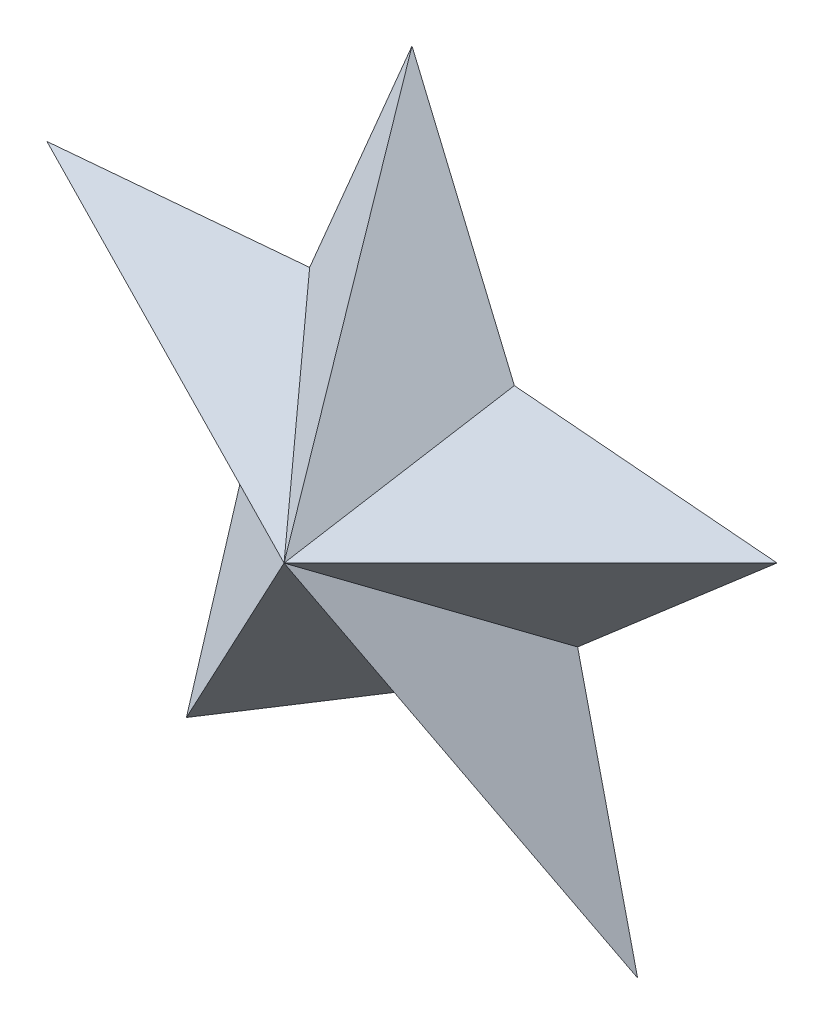
ISO-10303-21;
HEADER;
FILE_DESCRIPTION(('STEP AP214'),'2;1');
FILE_NAME('part.step','',(''),(''),'','','');
FILE_SCHEMA(('AUTOMOTIVE_DESIGN { 1 0 10303 214 1 1 1 1 }'));
ENDSEC;
DATA;
#1=APPLICATION_CONTEXT('core data for automotive mechanical design processes');
#2=APPLICATION_PROTOCOL_DEFINITION('international standard','automotive_design',2000,#1);
#3=PRODUCT_CONTEXT('',#1,'mechanical');
#4=PRODUCT('Part','Part','',(#3));
#5=PRODUCT_RELATED_PRODUCT_CATEGORY('part','',(#4));
#6=PRODUCT_DEFINITION_FORMATION('','',#4);
#7=PRODUCT_DEFINITION_CONTEXT('part definition',#1,'design');
#8=PRODUCT_DEFINITION('design','',#6,#7);
#9=PRODUCT_DEFINITION_SHAPE('','',#8);
#10=(LENGTH_UNIT() NAMED_UNIT(*) SI_UNIT(.MILLI.,.METRE.));
#11=(NAMED_UNIT(*) PLANE_ANGLE_UNIT() SI_UNIT($,.RADIAN.));
#12=(NAMED_UNIT(*) SI_UNIT($,.STERADIAN.) SOLID_ANGLE_UNIT());
#13=UNCERTAINTY_MEASURE_WITH_UNIT(LENGTH_MEASURE(1.E-05),#10,'distance_accuracy_value','');
#14=(GEOMETRIC_REPRESENTATION_CONTEXT(3) GLOBAL_UNCERTAINTY_ASSIGNED_CONTEXT((#13)) GLOBAL_UNIT_ASSIGNED_CONTEXT((#10,
#11,#12)) REPRESENTATION_CONTEXT('',''));
#15=CARTESIAN_POINT('',(0.,0.,0.));
#16=DIRECTION('',(0.,0.,1.));
#17=DIRECTION('',(1.,0.,0.));
#18=AXIS2_PLACEMENT_3D('',#15,#16,#17);
#19=CARTESIAN_POINT('',(0.,0.,0.));
#20=DIRECTION('',(0.,0.,1.));
#21=DIRECTION('',(1.,0.,0.));
#22=AXIS2_PLACEMENT_3D('',#19,#20,#21);
#23=PLANE('',#22);
#24=DIRECTION('',(-0.388248879692783,-0.921554560195596,0.));
#25=VECTOR('',#24,1.);
#26=CARTESIAN_POINT('',(0.,30.,0.));
#27=LINE('',#26,#25);
#28=CARTESIAN_POINT('',(0.,30.,0.));
#29=VERTEX_POINT('',#28);
#30=CARTESIAN_POINT('',(-8.,11.0110553637695,0.));
#31=VERTEX_POINT('',#30);
#32=EDGE_CURVE('E79',#29,#31,#27,.T.);
#33=ORIENTED_EDGE('',*,*,#32,.F.);
#34=DIRECTION('',(0.388248879692783,-0.921554560195596,0.));
#35=VECTOR('',#34,1.);
#36=CARTESIAN_POINT('',(0.,30.,0.));
#37=LINE('',#36,#35);
#38=CARTESIAN_POINT('',(8.,11.0110553637695,0.));
#39=VERTEX_POINT('',#38);
#40=EDGE_CURVE('E138',#29,#39,#37,.T.);
#41=ORIENTED_EDGE('',*,*,#40,.T.);
#42=DIRECTION('',(-0.996425971467642,0.0844706066319337,0.));
#43=VECTOR('',#42,1.);
#44=CARTESIAN_POINT('',(28.5316954888545,9.27050983124875,0.));
#45=LINE('',#44,#43);
#46=CARTESIAN_POINT('',(28.5316954888545,9.27050983124875,0.));
#47=VERTEX_POINT('',#46);
#48=EDGE_CURVE('E117',#47,#39,#45,.T.);
#49=ORIENTED_EDGE('',*,*,#48,.F.);
#50=DIRECTION('',(-0.756474967723424,-0.654022647320293,0.));
#51=VECTOR('',#50,1.);
#52=CARTESIAN_POINT('',(28.5316954888545,9.27050983124875,0.));
#53=LINE('',#52,#51);
#54=CARTESIAN_POINT('',(12.9442719099993,-4.20584889695288,0.));
#55=VERTEX_POINT('',#54);
#56=EDGE_CURVE('E130',#47,#55,#53,.T.);
#57=ORIENTED_EDGE('',*,*,#56,.T.);
#58=DIRECTION('',(-0.22757623794736,0.973760266144458,0.));
#59=VECTOR('',#58,1.);
#60=CARTESIAN_POINT('',(17.6335575687744,-24.2705098312483,0.));
#61=LINE('',#60,#59);
#62=CARTESIAN_POINT('',(17.6335575687744,-24.2705098312483,0.));
#63=VERTEX_POINT('',#62);
#64=EDGE_CURVE('E127',#63,#55,#61,.T.);
#65=ORIENTED_EDGE('',*,*,#64,.F.);
#66=DIRECTION('',(-0.855776121384348,0.517346334739468,0.));
#67=VECTOR('',#66,1.);
#68=CARTESIAN_POINT('',(17.6335575687744,-24.2705098312483,0.));
#69=LINE('',#68,#67);
#70=CARTESIAN_POINT('',(0.,-13.6104129336327,0.));
#71=VERTEX_POINT('',#70);
#72=EDGE_CURVE('E223',#63,#71,#69,.T.);
#73=ORIENTED_EDGE('',*,*,#72,.T.);
#74=DIRECTION('',(0.855776121384341,0.51734633473948,0.));
#75=VECTOR('',#74,1.);
#76=CARTESIAN_POINT('',(-17.6335575687741,-24.2705098312485,0.));
#77=LINE('',#76,#75);
#78=CARTESIAN_POINT('',(-17.6335575687741,-24.2705098312485,0.));
#79=VERTEX_POINT('',#78);
#80=EDGE_CURVE('E263',#79,#71,#77,.T.);
#81=ORIENTED_EDGE('',*,*,#80,.F.);
#82=DIRECTION('',(0.227576237947346,0.973760266144462,0.));
#83=VECTOR('',#82,1.);
#84=CARTESIAN_POINT('',(-17.6335575687741,-24.2705098312485,0.));
#85=LINE('',#84,#83);
#86=CARTESIAN_POINT('',(-12.9442719099993,-4.20584889695306,0.));
#87=VERTEX_POINT('',#86);
#88=EDGE_CURVE('E276',#79,#87,#85,.T.);
#89=ORIENTED_EDGE('',*,*,#88,.T.);
#90=DIRECTION('',(0.756474967723434,-0.654022647320282,0.));
#91=VECTOR('',#90,1.);
#92=CARTESIAN_POINT('',(-28.5316954888546,9.27050983124834,0.));
#93=LINE('',#92,#91);
#94=CARTESIAN_POINT('',(-28.5316954888546,9.27050983124834,0.));
#95=VERTEX_POINT('',#94);
#96=EDGE_CURVE('E274',#95,#87,#93,.T.);
#97=ORIENTED_EDGE('',*,*,#96,.F.);
#98=DIRECTION('',(0.996425971467641,0.0844706066319479,0.));
#99=VECTOR('',#98,1.);
#100=CARTESIAN_POINT('',(-28.5316954888546,9.27050983124834,0.));
#101=LINE('',#100,#99);
#102=EDGE_CURVE('E279',#95,#31,#101,.T.);
#103=ORIENTED_EDGE('',*,*,#102,.T.);
#104=EDGE_LOOP('',(#33,#41,#49,#57,#65,#73,#81,#89,#97,#103));
#105=FACE_BOUND('',#104,.T.);
#106=ADVANCED_FACE('F63',(#105),#23,.F.);
#107=CARTESIAN_POINT('',(4.55470490005661,1.91888701023072,5.75666103069215));
#108=DIRECTION('',(-0.600309084213925,-0.252908877544905,-0.758726632634716));
#109=DIRECTION('',(-0.784221595836781,0.,0.62048085274504));
#110=AXIS2_PLACEMENT_3D('',#107,#108,#109);
#111=PLANE('',#110);
#112=DIRECTION('',(0.,-0.948683298050514,0.316227766016838));
#113=VECTOR('',#112,1.);
#114=CARTESIAN_POINT('',(0.,30.,0.));
#115=LINE('',#114,#113);
#116=CARTESIAN_POINT('',(0.,0.,10.));
#117=VERTEX_POINT('',#116);
#118=EDGE_CURVE('E84',#29,#117,#115,.T.);
#119=ORIENTED_EDGE('',*,*,#118,.T.);
#120=DIRECTION('',(-0.47367692667049,-0.65196035801362,0.592096158338113));
#121=VECTOR('',#120,1.);
#122=CARTESIAN_POINT('',(8.,11.0110553637695,0.));
#123=LINE('',#122,#121);
#124=EDGE_CURVE('E71',#39,#117,#123,.T.);
#125=ORIENTED_EDGE('',*,*,#124,.F.);
#126=ORIENTED_EDGE('',*,*,#40,.F.);
#127=EDGE_LOOP('',(#119,#125,#126));
#128=FACE_BOUND('',#127,.T.);
#129=ADVANCED_FACE('F154',(#128),#111,.F.);
#130=CARTESIAN_POINT('',(-4.55470490005662,1.91888701023072,5.75666103069215));
#131=DIRECTION('',(0.600309084213925,-0.252908877544905,-0.758726632634716));
#132=DIRECTION('',(-0.784221595836781,0.,-0.62048085274504));
#133=AXIS2_PLACEMENT_3D('',#130,#131,#132);
#134=PLANE('',#133);
#135=DIRECTION('',(0.47367692667049,-0.65196035801362,0.592096158338113));
#136=VECTOR('',#135,1.);
#137=CARTESIAN_POINT('',(-8.,11.0110553637695,0.));
#138=LINE('',#137,#136);
#139=EDGE_CURVE('E12',#31,#117,#138,.T.);
#140=ORIENTED_EDGE('',*,*,#139,.T.);
#141=ORIENTED_EDGE('',*,*,#118,.F.);
#142=ORIENTED_EDGE('',*,*,#32,.T.);
#143=EDGE_LOOP('',(#140,#141,#142));
#144=FACE_BOUND('',#143,.T.);
#145=ADVANCED_FACE('F61',(#144),#134,.F.);
#146=CARTESIAN_POINT('',(-0.417488776633722,4.92475047144693,5.75666103069215));
#147=DIRECTION('',(0.0550249271182127,-0.649081007522498,-0.758726632634716));
#148=DIRECTION('',(-0.242337800469405,-0.745839058939956,0.62048085274504));
#149=AXIS2_PLACEMENT_3D('',#146,#147,#148);
#150=PLANE('',#149);
#151=DIRECTION('',(0.90225143251132,-0.29315926137728,0.316227766016838));
#152=VECTOR('',#151,1.);
#153=CARTESIAN_POINT('',(-28.5316954888546,9.27050983124834,0.));
#154=LINE('',#153,#152);
#155=EDGE_CURVE('E315',#95,#117,#154,.T.);
#156=ORIENTED_EDGE('',*,*,#155,.T.);
#157=ORIENTED_EDGE('',*,*,#139,.F.);
#158=ORIENTED_EDGE('',*,*,#102,.F.);
#159=EDGE_LOOP('',(#156,#157,#158));
#160=FACE_BOUND('',#159,.T.);
#161=ADVANCED_FACE('F331',(#160),#150,.F.);
#162=CARTESIAN_POINT('',(-3.23245121359438,-3.73881307855369,5.75666103069215));
#163=DIRECTION('',(0.426036344917738,0.492774725143163,-0.758726632634716));
#164=DIRECTION('',(-0.242337800469405,-0.745839058939956,-0.62048085274504));
#165=AXIS2_PLACEMENT_3D('',#162,#163,#164);
#166=PLANE('',#165);
#167=DIRECTION('',(0.766425367039452,0.24902669744365,0.592096158338113));
#168=VECTOR('',#167,1.);
#169=CARTESIAN_POINT('',(-12.9442719099993,-4.20584889695306,0.));
#170=LINE('',#169,#168);
#171=EDGE_CURVE('E310',#87,#117,#170,.T.);
#172=ORIENTED_EDGE('',*,*,#171,.T.);
#173=ORIENTED_EDGE('',*,*,#155,.F.);
#174=ORIENTED_EDGE('',*,*,#96,.T.);
#175=EDGE_LOOP('',(#172,#173,#174));
#176=FACE_BOUND('',#175,.T.);
#177=ADVANCED_FACE('F156',(#176),#166,.F.);
#178=CARTESIAN_POINT('',(-4.81272715393786,1.12477616723553,5.75666103069215));
#179=DIRECTION('',(0.634316359401466,-0.148245246556021,-0.758726632634716));
#180=DIRECTION('',(0.6344485983878,-0.460953888562125,0.62048085274504));
#181=AXIS2_PLACEMENT_3D('',#178,#179,#180);
#182=PLANE('',#181);
#183=DIRECTION('',(0.557622051690272,0.767500910402542,0.316227766016838));
#184=VECTOR('',#183,1.);
#185=CARTESIAN_POINT('',(-17.6335575687741,-24.2705098312485,0.));
#186=LINE('',#185,#184);
#187=EDGE_CURVE('E277',#79,#117,#186,.T.);
#188=ORIENTED_EDGE('',*,*,#187,.T.);
#189=ORIENTED_EDGE('',*,*,#171,.F.);
#190=ORIENTED_EDGE('',*,*,#88,.F.);
#191=EDGE_LOOP('',(#188,#189,#190));
#192=FACE_BOUND('',#191,.T.);
#193=ADVANCED_FACE('F248',(#192),#182,.F.);
#194=CARTESIAN_POINT('',(2.55694018307946,-4.22960057035951,5.75666103069215));
#195=DIRECTION('',(-0.337004142611992,0.557460406480265,-0.758726632634716));
#196=DIRECTION('',(0.6344485983878,-0.460953888562125,-0.62048085274504));
#197=AXIS2_PLACEMENT_3D('',#194,#195,#196);
#198=PLANE('',#197);
#199=DIRECTION('',(0.,0.805867321139931,0.592096158338113));
#200=VECTOR('',#199,1.);
#201=CARTESIAN_POINT('',(0.,-13.6104129336327,0.));
#202=LINE('',#201,#200);
#203=EDGE_CURVE('E275',#71,#117,#202,.T.);
#204=ORIENTED_EDGE('',*,*,#203,.T.);
#205=ORIENTED_EDGE('',*,*,#187,.F.);
#206=ORIENTED_EDGE('',*,*,#80,.T.);
#207=EDGE_LOOP('',(#204,#205,#206));
#208=FACE_BOUND('',#207,.T.);
#209=ADVANCED_FACE('F245',(#208),#198,.F.);
#210=CARTESIAN_POINT('',(-2.5569401830794,-4.22960057035955,5.75666103069215));
#211=DIRECTION('',(0.337004142611984,0.557460406480269,-0.758726632634716));
#212=DIRECTION('',(0.634448598387794,0.460953888562134,0.62048085274504));
#213=AXIS2_PLACEMENT_3D('',#210,#211,#212);
#214=PLANE('',#213);
#215=DIRECTION('',(-0.557622051690284,0.767500910402534,0.316227766016838));
#216=VECTOR('',#215,1.);
#217=CARTESIAN_POINT('',(17.6335575687744,-24.2705098312483,0.));
#218=LINE('',#217,#216);
#219=EDGE_CURVE('E229',#63,#117,#218,.T.);
#220=ORIENTED_EDGE('',*,*,#219,.T.);
#221=ORIENTED_EDGE('',*,*,#203,.F.);
#222=ORIENTED_EDGE('',*,*,#72,.F.);
#223=EDGE_LOOP('',(#220,#221,#222));
#224=FACE_BOUND('',#223,.T.);
#225=ADVANCED_FACE('F235',(#224),#214,.F.);
#226=CARTESIAN_POINT('',(4.81272715393785,1.1247761672356,5.75666103069215));
#227=DIRECTION('',(-0.634316359401464,-0.14824524655603,-0.758726632634716));
#228=DIRECTION('',(0.634448598387794,0.460953888562134,-0.62048085274504));
#229=AXIS2_PLACEMENT_3D('',#226,#227,#228);
#230=PLANE('',#229);
#231=DIRECTION('',(-0.766425367039451,0.24902669744365,0.592096158338113));
#232=VECTOR('',#231,1.);
#233=CARTESIAN_POINT('',(12.9442719099993,-4.20584889695306,0.));
#234=LINE('',#233,#232);
#235=EDGE_CURVE('E135',#55,#117,#234,.T.);
#236=ORIENTED_EDGE('',*,*,#235,.T.);
#237=ORIENTED_EDGE('',*,*,#219,.F.);
#238=ORIENTED_EDGE('',*,*,#64,.T.);
#239=EDGE_LOOP('',(#236,#237,#238));
#240=FACE_BOUND('',#239,.T.);
#241=ADVANCED_FACE('F243',(#240),#230,.F.);
#242=CARTESIAN_POINT('',(3.23245121359443,-3.73881307855365,5.75666103069215));
#243=DIRECTION('',(-0.426036344917745,0.492774725143156,-0.758726632634716));
#244=DIRECTION('',(-0.242337800469415,0.745839058939953,0.62048085274504));
#245=AXIS2_PLACEMENT_3D('',#242,#243,#244);
#246=PLANE('',#245);
#247=DIRECTION('',(-0.902251432511315,-0.293159261377292,0.316227766016838));
#248=VECTOR('',#247,1.);
#249=CARTESIAN_POINT('',(28.5316954888545,9.27050983124875,0.));
#250=LINE('',#249,#248);
#251=EDGE_CURVE('E113',#47,#117,#250,.T.);
#252=ORIENTED_EDGE('',*,*,#251,.T.);
#253=ORIENTED_EDGE('',*,*,#235,.F.);
#254=ORIENTED_EDGE('',*,*,#56,.F.);
#255=EDGE_LOOP('',(#252,#253,#254));
#256=FACE_BOUND('',#255,.T.);
#257=ADVANCED_FACE('F128',(#256),#246,.F.);
#258=CARTESIAN_POINT('',(0.417488776633653,4.92475047144694,5.75666103069215));
#259=DIRECTION('',(-0.0550249271182036,-0.649081007522498,-0.758726632634716));
#260=DIRECTION('',(-0.242337800469415,0.745839058939953,-0.62048085274504));
#261=AXIS2_PLACEMENT_3D('',#258,#259,#260);
#262=PLANE('',#261);
#263=ORIENTED_EDGE('',*,*,#124,.T.);
#264=ORIENTED_EDGE('',*,*,#251,.F.);
#265=ORIENTED_EDGE('',*,*,#48,.T.);
#266=EDGE_LOOP('',(#263,#264,#265));
#267=FACE_BOUND('',#266,.T.);
#268=ADVANCED_FACE('F120',(#267),#262,.F.);
#269=CLOSED_SHELL('',(#106,#129,#145,#161,#177,#193,#209,#225,#241,#257,#268));
#270=MANIFOLD_SOLID_BREP('B2',#269);
#271=ADVANCED_BREP_SHAPE_REPRESENTATION('',(#18,#270),#14);
#272=SHAPE_DEFINITION_REPRESENTATION(#9,#271);
ENDSEC;
END-ISO-10303-21;
